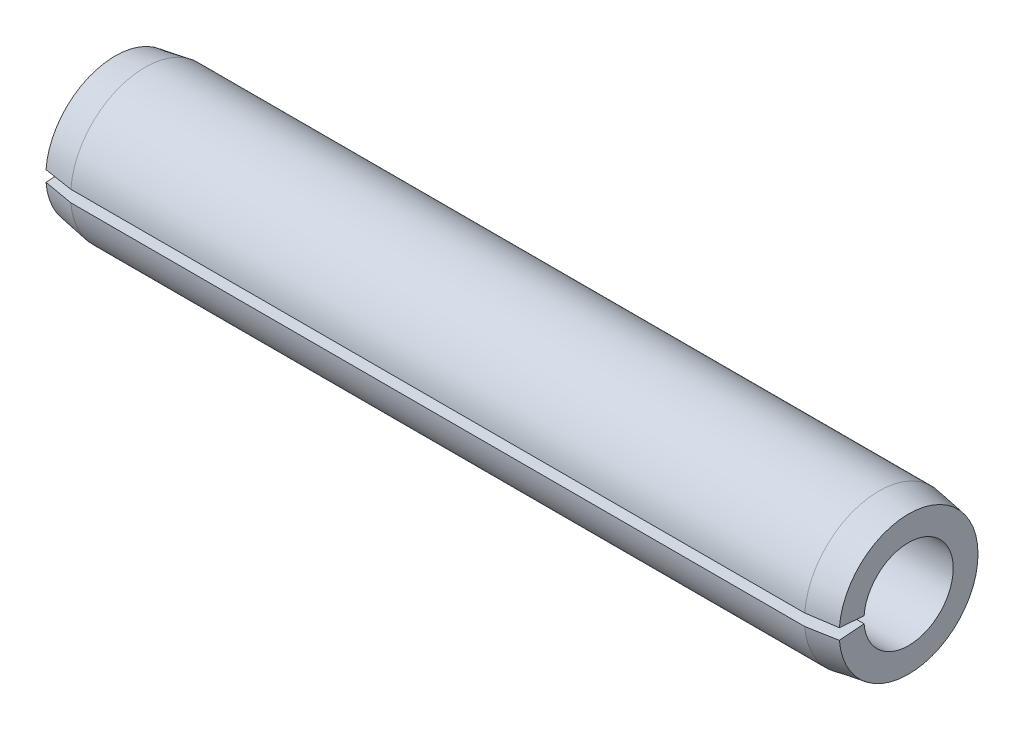
ISO-10303-21;
HEADER;
FILE_DESCRIPTION(('STEP AP214'),'2;1');
FILE_NAME('part.step','',(''),(''),'','','');
FILE_SCHEMA(('AUTOMOTIVE_DESIGN { 1 0 10303 214 1 1 1 1 }'));
ENDSEC;
DATA;
#1=APPLICATION_CONTEXT('core data for automotive mechanical design processes');
#2=APPLICATION_PROTOCOL_DEFINITION('international standard','automotive_design',2000,#1);
#3=PRODUCT_CONTEXT('',#1,'mechanical');
#4=PRODUCT('Part','Part','',(#3));
#5=PRODUCT_RELATED_PRODUCT_CATEGORY('part','',(#4));
#6=PRODUCT_DEFINITION_FORMATION('','',#4);
#7=PRODUCT_DEFINITION_CONTEXT('part definition',#1,'design');
#8=PRODUCT_DEFINITION('design','',#6,#7);
#9=PRODUCT_DEFINITION_SHAPE('','',#8);
#10=(LENGTH_UNIT() NAMED_UNIT(*) SI_UNIT(.MILLI.,.METRE.));
#11=(NAMED_UNIT(*) PLANE_ANGLE_UNIT() SI_UNIT($,.RADIAN.));
#12=(NAMED_UNIT(*) SI_UNIT($,.STERADIAN.) SOLID_ANGLE_UNIT());
#13=UNCERTAINTY_MEASURE_WITH_UNIT(LENGTH_MEASURE(1.E-05),#10,'distance_accuracy_value','');
#14=(GEOMETRIC_REPRESENTATION_CONTEXT(3) GLOBAL_UNCERTAINTY_ASSIGNED_CONTEXT((#13)) GLOBAL_UNIT_ASSIGNED_CONTEXT((#10,
#11,#12)) REPRESENTATION_CONTEXT('',''));
#15=CARTESIAN_POINT('',(0.,0.,0.));
#16=DIRECTION('',(0.,0.,1.));
#17=DIRECTION('',(1.,0.,0.));
#18=AXIS2_PLACEMENT_3D('',#15,#16,#17);
#19=CARTESIAN_POINT('',(0.,8.89,0.));
#20=DIRECTION('',(1.,0.,0.));
#21=DIRECTION('',(0.,0.,-1.));
#22=AXIS2_PLACEMENT_3D('',#19,#20,#21);
#23=PLANE('',#22);
#24=DIRECTION('',(0.,0.0784590957278456,0.996917333733128));
#25=VECTOR('',#24,1.);
#26=CARTESIAN_POINT('',(0.,0.,0.));
#27=LINE('',#26,#25);
#28=CARTESIAN_POINT('',(0.,0.448393732084638,5.69738256228483));
#29=VERTEX_POINT('',#28);
#30=CARTESIAN_POINT('',(0.,0.697501361020547,8.86259509688751));
#31=VERTEX_POINT('',#30);
#32=EDGE_CURVE('E81',#29,#31,#27,.T.);
#33=ORIENTED_EDGE('',*,*,#32,.T.);
#34=CARTESIAN_POINT('',(0.,0.,0.));
#35=DIRECTION('',(-1.,0.,0.));
#36=DIRECTION('',(0.,0.,1.));
#37=AXIS2_PLACEMENT_3D('',#34,#35,#36);
#38=CIRCLE('',#37,8.89);
#39=CARTESIAN_POINT('',(0.,-0.697501361020547,8.86259509688751));
#40=VERTEX_POINT('',#39);
#41=EDGE_CURVE('E99',#31,#40,#38,.T.);
#42=ORIENTED_EDGE('',*,*,#41,.T.);
#43=DIRECTION('',(0.,-0.0784590957278456,0.996917333733128));
#44=VECTOR('',#43,1.);
#45=CARTESIAN_POINT('',(0.,0.,0.));
#46=LINE('',#45,#44);
#47=CARTESIAN_POINT('',(0.,-0.448393732084638,5.69738256228483));
#48=VERTEX_POINT('',#47);
#49=EDGE_CURVE('E53',#48,#40,#46,.T.);
#50=ORIENTED_EDGE('',*,*,#49,.F.);
#51=CARTESIAN_POINT('',(0.,0.,0.));
#52=DIRECTION('',(-1.,0.,0.));
#53=DIRECTION('',(0.,0.,1.));
#54=AXIS2_PLACEMENT_3D('',#51,#52,#53);
#55=CIRCLE('',#54,5.715);
#56=EDGE_CURVE('E96',#29,#48,#55,.T.);
#57=ORIENTED_EDGE('',*,*,#56,.F.);
#58=EDGE_LOOP('',(#33,#42,#50,#57));
#59=FACE_BOUND('',#58,.T.);
#60=ADVANCED_FACE('F32',(#59),#23,.F.);
#61=CARTESIAN_POINT('',(-9.52499999999999,0.,0.));
#62=DIRECTION('',(-1.,0.,0.));
#63=DIRECTION('',(0.,0.,1.));
#64=AXIS2_PLACEMENT_3D('',#61,#62,#63);
#65=CYLINDRICAL_SURFACE('',#64,5.715);
#66=DIRECTION('',(-1.,0.,0.));
#67=VECTOR('',#66,1.);
#68=CARTESIAN_POINT('',(-9.52499999999999,0.448393732084638,5.69738256228483));
#69=LINE('',#68,#67);
#70=CARTESIAN_POINT('',(101.6,0.448393732084638,5.69738256228483));
#71=VERTEX_POINT('',#70);
#72=EDGE_CURVE('E84',#29,#71,#69,.F.);
#73=ORIENTED_EDGE('',*,*,#72,.F.);
#74=ORIENTED_EDGE('',*,*,#56,.T.);
#75=DIRECTION('',(-1.,0.,0.));
#76=VECTOR('',#75,1.);
#77=CARTESIAN_POINT('',(-9.52499999999999,-0.448393732084638,5.69738256228483));
#78=LINE('',#77,#76);
#79=CARTESIAN_POINT('',(101.6,-0.448393732084638,5.69738256228483));
#80=VERTEX_POINT('',#79);
#81=EDGE_CURVE('E117',#48,#80,#78,.F.);
#82=ORIENTED_EDGE('',*,*,#81,.T.);
#83=CARTESIAN_POINT('',(101.6,0.,0.));
#84=DIRECTION('',(-1.,0.,0.));
#85=DIRECTION('',(0.,0.,1.));
#86=AXIS2_PLACEMENT_3D('',#83,#84,#85);
#87=CIRCLE('',#86,5.715);
#88=EDGE_CURVE('E98',#71,#80,#87,.T.);
#89=ORIENTED_EDGE('',*,*,#88,.F.);
#90=EDGE_LOOP('',(#73,#74,#82,#89));
#91=FACE_BOUND('',#90,.T.);
#92=ADVANCED_FACE('F94',(#91),#65,.F.);
#93=CARTESIAN_POINT('',(101.6,5.715,0.));
#94=DIRECTION('',(-1.,0.,0.));
#95=DIRECTION('',(0.,0.,1.));
#96=AXIS2_PLACEMENT_3D('',#93,#94,#95);
#97=PLANE('',#96);
#98=DIRECTION('',(0.,0.0784590957278456,0.996917333733128));
#99=VECTOR('',#98,1.);
#100=CARTESIAN_POINT('',(101.6,0.,0.));
#101=LINE('',#100,#99);
#102=CARTESIAN_POINT('',(101.6,0.697501361020547,8.86259509688751));
#103=VERTEX_POINT('',#102);
#104=EDGE_CURVE('E126',#71,#103,#101,.T.);
#105=ORIENTED_EDGE('',*,*,#104,.F.);
#106=ORIENTED_EDGE('',*,*,#88,.T.);
#107=DIRECTION('',(0.,-0.0784590957278456,0.996917333733128));
#108=VECTOR('',#107,1.);
#109=CARTESIAN_POINT('',(101.6,0.,0.));
#110=LINE('',#109,#108);
#111=CARTESIAN_POINT('',(101.6,-0.697501361020547,8.86259509688751));
#112=VERTEX_POINT('',#111);
#113=EDGE_CURVE('E125',#80,#112,#110,.T.);
#114=ORIENTED_EDGE('',*,*,#113,.T.);
#115=CARTESIAN_POINT('',(101.6,0.,0.));
#116=DIRECTION('',(-1.,0.,0.));
#117=DIRECTION('',(0.,0.,1.));
#118=AXIS2_PLACEMENT_3D('',#115,#116,#117);
#119=CIRCLE('',#118,8.89);
#120=EDGE_CURVE('E103',#103,#112,#119,.T.);
#121=ORIENTED_EDGE('',*,*,#120,.F.);
#122=EDGE_LOOP('',(#105,#106,#114,#121));
#123=FACE_BOUND('',#122,.T.);
#124=ADVANCED_FACE('F136',(#123),#97,.F.);
#125=CARTESIAN_POINT('',(101.6,0.,0.));
#126=DIRECTION('',(-1.,0.,0.));
#127=DIRECTION('',(0.,0.,1.));
#128=AXIS2_PLACEMENT_3D('',#125,#126,#127);
#129=CONICAL_SURFACE('',#128,8.89,0.165148677414631);
#130=DIRECTION('',(-0.986393923832143,0.0128985958825522,0.163892200092887));
#131=VECTOR('',#130,1.);
#132=CARTESIAN_POINT('',(154.939999999999,0.,0.));
#133=LINE('',#132,#131);
#134=CARTESIAN_POINT('',(97.79,0.74732288680773,9.49563760380805));
#135=VERTEX_POINT('',#134);
#136=EDGE_CURVE('E100',#103,#135,#133,.T.);
#137=ORIENTED_EDGE('',*,*,#136,.F.);
#138=ORIENTED_EDGE('',*,*,#120,.T.);
#139=DIRECTION('',(-0.986393923832143,-0.0128985958825522,0.163892200092887));
#140=VECTOR('',#139,1.);
#141=CARTESIAN_POINT('',(154.939999999999,0.,0.));
#142=LINE('',#141,#140);
#143=CARTESIAN_POINT('',(97.79,-0.74732288680773,9.49563760380805));
#144=VERTEX_POINT('',#143);
#145=EDGE_CURVE('E119',#112,#144,#142,.T.);
#146=ORIENTED_EDGE('',*,*,#145,.T.);
#147=CARTESIAN_POINT('',(97.79,0.,0.));
#148=DIRECTION('',(-1.,0.,0.));
#149=DIRECTION('',(0.,0.,1.));
#150=AXIS2_PLACEMENT_3D('',#147,#148,#149);
#151=CIRCLE('',#150,9.52500000000001);
#152=EDGE_CURVE('E108',#135,#144,#151,.T.);
#153=ORIENTED_EDGE('',*,*,#152,.F.);
#154=EDGE_LOOP('',(#137,#138,#146,#153));
#155=FACE_BOUND('',#154,.T.);
#156=ADVANCED_FACE('F135',(#155),#129,.T.);
#157=CARTESIAN_POINT('',(-9.52499999999999,0.,0.));
#158=DIRECTION('',(-1.,0.,0.));
#159=DIRECTION('',(0.,0.,1.));
#160=AXIS2_PLACEMENT_3D('',#157,#158,#159);
#161=CYLINDRICAL_SURFACE('',#160,9.52500000000001);
#162=DIRECTION('',(-1.,0.,0.));
#163=VECTOR('',#162,1.);
#164=CARTESIAN_POINT('',(-9.52499999999999,0.74732288680773,9.49563760380805));
#165=LINE('',#164,#163);
#166=CARTESIAN_POINT('',(3.81,0.747322886807729,9.49563760380804));
#167=VERTEX_POINT('',#166);
#168=EDGE_CURVE('E45',#135,#167,#165,.T.);
#169=ORIENTED_EDGE('',*,*,#168,.F.);
#170=ORIENTED_EDGE('',*,*,#152,.T.);
#171=DIRECTION('',(-1.,0.,0.));
#172=VECTOR('',#171,1.);
#173=CARTESIAN_POINT('',(-9.52499999999999,-0.74732288680773,9.49563760380805));
#174=LINE('',#173,#172);
#175=CARTESIAN_POINT('',(3.81,-0.747322886807729,9.49563760380804));
#176=VERTEX_POINT('',#175);
#177=EDGE_CURVE('E122',#144,#176,#174,.T.);
#178=ORIENTED_EDGE('',*,*,#177,.T.);
#179=CARTESIAN_POINT('',(3.81,0.,0.));
#180=DIRECTION('',(-1.,0.,0.));
#181=DIRECTION('',(0.,0.,1.));
#182=AXIS2_PLACEMENT_3D('',#179,#180,#181);
#183=CIRCLE('',#182,9.525);
#184=EDGE_CURVE('E111',#167,#176,#183,.T.);
#185=ORIENTED_EDGE('',*,*,#184,.F.);
#186=EDGE_LOOP('',(#169,#170,#178,#185));
#187=FACE_BOUND('',#186,.T.);
#188=ADVANCED_FACE('F139',(#187),#161,.T.);
#189=CARTESIAN_POINT('',(3.81,0.,0.));
#190=DIRECTION('',(1.,0.,0.));
#191=DIRECTION('',(0.,0.,-1.));
#192=AXIS2_PLACEMENT_3D('',#189,#190,#191);
#193=CONICAL_SURFACE('',#192,9.525,0.165148677414627);
#194=DIRECTION('',(-0.986393923832144,-0.0128985958825519,-0.163892200092884));
#195=VECTOR('',#194,1.);
#196=CARTESIAN_POINT('',(-53.3399999999998,0.,0.));
#197=LINE('',#196,#195);
#198=EDGE_CURVE('E11',#167,#31,#197,.T.);
#199=ORIENTED_EDGE('',*,*,#198,.F.);
#200=ORIENTED_EDGE('',*,*,#184,.T.);
#201=DIRECTION('',(-0.986393923832144,0.0128985958825519,-0.163892200092884));
#202=VECTOR('',#201,1.);
#203=CARTESIAN_POINT('',(-53.3399999999998,0.,0.));
#204=LINE('',#203,#202);
#205=EDGE_CURVE('E39',#176,#40,#204,.T.);
#206=ORIENTED_EDGE('',*,*,#205,.T.);
#207=ORIENTED_EDGE('',*,*,#41,.F.);
#208=EDGE_LOOP('',(#199,#200,#206,#207));
#209=FACE_BOUND('',#208,.T.);
#210=ADVANCED_FACE('F142',(#209),#193,.T.);
#211=CARTESIAN_POINT('',(101.6,0.,0.));
#212=DIRECTION('',(0.,-0.996917333733128,-0.0784590957278456));
#213=DIRECTION('',(0.,0.0784590957278456,-0.996917333733128));
#214=AXIS2_PLACEMENT_3D('',#211,#212,#213);
#215=PLANE('',#214);
#216=ORIENTED_EDGE('',*,*,#49,.T.);
#217=ORIENTED_EDGE('',*,*,#205,.F.);
#218=ORIENTED_EDGE('',*,*,#177,.F.);
#219=ORIENTED_EDGE('',*,*,#145,.F.);
#220=ORIENTED_EDGE('',*,*,#113,.F.);
#221=ORIENTED_EDGE('',*,*,#81,.F.);
#222=EDGE_LOOP('',(#216,#217,#218,#219,#220,#221));
#223=FACE_BOUND('',#222,.T.);
#224=ADVANCED_FACE('F137',(#223),#215,.F.);
#225=CARTESIAN_POINT('',(101.6,0.,0.));
#226=DIRECTION('',(0.,-0.996917333733128,0.0784590957278456));
#227=DIRECTION('',(0.,-0.0784590957278456,-0.996917333733128));
#228=AXIS2_PLACEMENT_3D('',#225,#226,#227);
#229=PLANE('',#228);
#230=ORIENTED_EDGE('',*,*,#72,.T.);
#231=ORIENTED_EDGE('',*,*,#104,.T.);
#232=ORIENTED_EDGE('',*,*,#136,.T.);
#233=ORIENTED_EDGE('',*,*,#168,.T.);
#234=ORIENTED_EDGE('',*,*,#198,.T.);
#235=ORIENTED_EDGE('',*,*,#32,.F.);
#236=EDGE_LOOP('',(#230,#231,#232,#233,#234,#235));
#237=FACE_BOUND('',#236,.T.);
#238=ADVANCED_FACE('F83',(#237),#229,.T.);
#239=CLOSED_SHELL('',(#60,#92,#124,#156,#188,#210,#224,#238));
#240=MANIFOLD_SOLID_BREP('B2',#239);
#241=ADVANCED_BREP_SHAPE_REPRESENTATION('',(#18,#240),#14);
#242=SHAPE_DEFINITION_REPRESENTATION(#9,#241);
ENDSEC;
END-ISO-10303-21;
